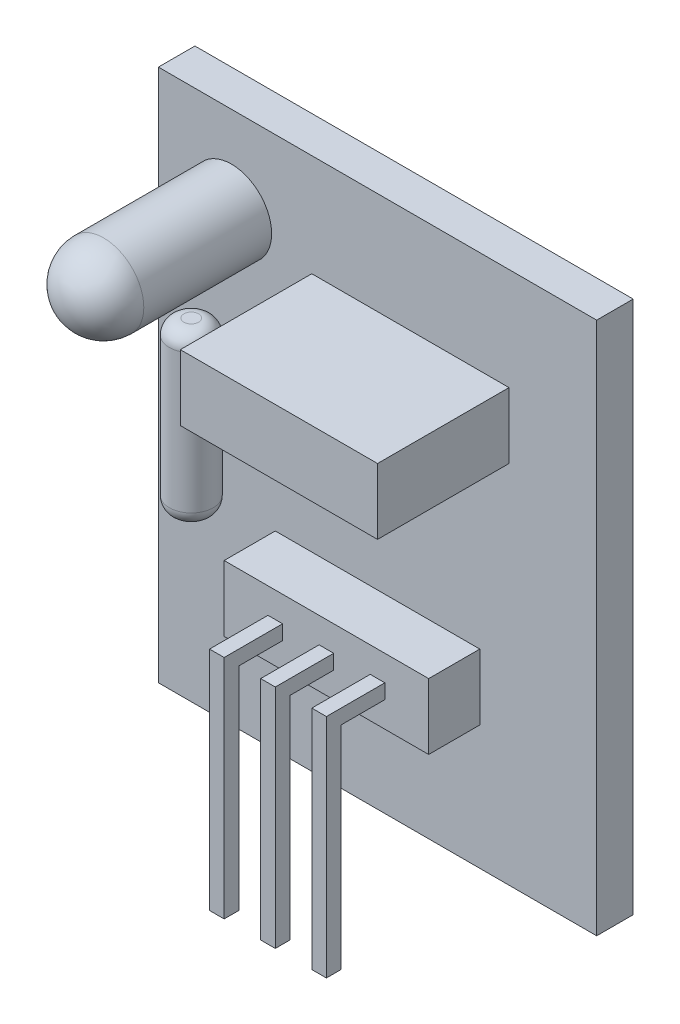
ISO-10303-21;
HEADER;
FILE_DESCRIPTION(('STEP AP214'),'2;1');
FILE_NAME('part.step','',(''),(''),'','','');
FILE_SCHEMA(('AUTOMOTIVE_DESIGN { 1 0 10303 214 1 1 1 1 }'));
ENDSEC;
DATA;
#1=APPLICATION_CONTEXT('core data for automotive mechanical design processes');
#2=APPLICATION_PROTOCOL_DEFINITION('international standard','automotive_design',2000,#1);
#3=PRODUCT_CONTEXT('',#1,'mechanical');
#4=PRODUCT('Part','Part','',(#3));
#5=PRODUCT_RELATED_PRODUCT_CATEGORY('part','',(#4));
#6=PRODUCT_DEFINITION_FORMATION('','',#4);
#7=PRODUCT_DEFINITION_CONTEXT('part definition',#1,'design');
#8=PRODUCT_DEFINITION('design','',#6,#7);
#9=PRODUCT_DEFINITION_SHAPE('','',#8);
#10=(LENGTH_UNIT() NAMED_UNIT(*) SI_UNIT(.MILLI.,.METRE.));
#11=(NAMED_UNIT(*) PLANE_ANGLE_UNIT() SI_UNIT($,.RADIAN.));
#12=(NAMED_UNIT(*) SI_UNIT($,.STERADIAN.) SOLID_ANGLE_UNIT());
#13=UNCERTAINTY_MEASURE_WITH_UNIT(LENGTH_MEASURE(1.E-05),#10,'distance_accuracy_value','');
#14=(GEOMETRIC_REPRESENTATION_CONTEXT(3) GLOBAL_UNCERTAINTY_ASSIGNED_CONTEXT((#13)) GLOBAL_UNIT_ASSIGNED_CONTEXT((#10,
#11,#12)) REPRESENTATION_CONTEXT('',''));
#15=CARTESIAN_POINT('',(0.,0.,0.));
#16=DIRECTION('',(0.,0.,1.));
#17=DIRECTION('',(1.,0.,0.));
#18=AXIS2_PLACEMENT_3D('',#15,#16,#17);
#19=CARTESIAN_POINT('',(-5.842,2.921,1.27));
#20=DIRECTION('',(0.,-1.,0.));
#21=DIRECTION('',(0.,0.,-1.));
#22=AXIS2_PLACEMENT_3D('',#19,#20,#21);
#23=CYLINDRICAL_SURFACE('',#22,0.762);
#24=CARTESIAN_POINT('',(-5.842,-2.413,1.27));
#25=DIRECTION('',(0.,1.,0.));
#26=DIRECTION('',(0.,0.,1.));
#27=AXIS2_PLACEMENT_3D('',#24,#25,#26);
#28=CIRCLE('',#27,0.762);
#29=CARTESIAN_POINT('',(-5.842,-2.413,2.032));
#30=VERTEX_POINT('',#29);
#31=EDGE_CURVE('E70',#30,#30,#28,.T.);
#32=ORIENTED_EDGE('',*,*,#31,.T.);
#33=EDGE_LOOP('',(#32));
#34=FACE_BOUND('',#33,.T.);
#35=CARTESIAN_POINT('',(-5.842,2.413,1.27));
#36=DIRECTION('',(0.,1.,0.));
#37=DIRECTION('',(0.,0.,1.));
#38=AXIS2_PLACEMENT_3D('',#35,#36,#37);
#39=CIRCLE('',#38,0.762);
#40=CARTESIAN_POINT('',(-5.842,2.413,2.032));
#41=VERTEX_POINT('',#40);
#42=EDGE_CURVE('E74',#41,#41,#39,.F.);
#43=ORIENTED_EDGE('',*,*,#42,.T.);
#44=EDGE_LOOP('',(#43));
#45=FACE_BOUND('',#44,.T.);
#46=ADVANCED_FACE('F59',(#34,#45),#23,.T.);
#47=CARTESIAN_POINT('',(-5.842,2.921,1.27));
#48=DIRECTION('',(0.,1.,0.));
#49=DIRECTION('',(0.,0.,1.));
#50=AXIS2_PLACEMENT_3D('',#47,#48,#49);
#51=PLANE('',#50);
#52=CARTESIAN_POINT('',(-5.842,2.921,1.27));
#53=DIRECTION('',(0.,1.,0.));
#54=DIRECTION('',(0.,0.,1.));
#55=AXIS2_PLACEMENT_3D('',#52,#53,#54);
#56=CIRCLE('',#55,0.254);
#57=CARTESIAN_POINT('',(-5.842,2.921,1.524));
#58=VERTEX_POINT('',#57);
#59=EDGE_CURVE('E11',#58,#58,#56,.T.);
#60=ORIENTED_EDGE('',*,*,#59,.T.);
#61=EDGE_LOOP('',(#60));
#62=FACE_BOUND('',#61,.T.);
#63=ADVANCED_FACE('F90',(#62),#51,.T.);
#64=CARTESIAN_POINT('',(-5.842,-2.921,1.27));
#65=DIRECTION('',(0.,1.,0.));
#66=DIRECTION('',(0.,0.,1.));
#67=AXIS2_PLACEMENT_3D('',#64,#65,#66);
#68=PLANE('',#67);
#69=CARTESIAN_POINT('',(-5.842,-2.921,1.27));
#70=DIRECTION('',(0.,1.,0.));
#71=DIRECTION('',(0.,0.,1.));
#72=AXIS2_PLACEMENT_3D('',#69,#70,#71);
#73=CIRCLE('',#72,0.254);
#74=CARTESIAN_POINT('',(-5.842,-2.921,1.524));
#75=VERTEX_POINT('',#74);
#76=EDGE_CURVE('E66',#75,#75,#73,.F.);
#77=ORIENTED_EDGE('',*,*,#76,.T.);
#78=EDGE_LOOP('',(#77));
#79=FACE_BOUND('',#78,.T.);
#80=ADVANCED_FACE('F87',(#79),#68,.F.);
#81=CARTESIAN_POINT('',(-5.842,-2.413,1.27));
#82=DIRECTION('',(0.,1.,0.));
#83=DIRECTION('',(0.,0.,1.));
#84=AXIS2_PLACEMENT_3D('',#81,#82,#83);
#85=DEGENERATE_TOROIDAL_SURFACE('',#84,0.254,0.508,.T.);
#86=ORIENTED_EDGE('',*,*,#76,.F.);
#87=EDGE_LOOP('',(#86));
#88=FACE_BOUND('',#87,.T.);
#89=ORIENTED_EDGE('',*,*,#31,.F.);
#90=EDGE_LOOP('',(#89));
#91=FACE_BOUND('',#90,.T.);
#92=ADVANCED_FACE('F83',(#88,#91),#85,.T.);
#93=CARTESIAN_POINT('',(-5.842,2.413,1.27));
#94=DIRECTION('',(0.,1.,0.));
#95=DIRECTION('',(0.,0.,1.));
#96=AXIS2_PLACEMENT_3D('',#93,#94,#95);
#97=DEGENERATE_TOROIDAL_SURFACE('',#96,0.254,0.508,.T.);
#98=ORIENTED_EDGE('',*,*,#42,.F.);
#99=EDGE_LOOP('',(#98));
#100=FACE_BOUND('',#99,.T.);
#101=ORIENTED_EDGE('',*,*,#59,.F.);
#102=EDGE_LOOP('',(#101));
#103=FACE_BOUND('',#102,.T.);
#104=ADVANCED_FACE('F61',(#100,#103),#97,.T.);
#105=CLOSED_SHELL('',(#46,#63,#80,#92,#104));
#106=MANIFOLD_SOLID_BREP('B2',#105);
#107=CARTESIAN_POINT('',(0.,0.,0.635));
#108=DIRECTION('',(0.,0.,1.));
#109=DIRECTION('',(1.,0.,0.));
#110=AXIS2_PLACEMENT_3D('',#107,#108,#109);
#111=PLANE('',#110);
#112=CARTESIAN_POINT('',(-5.08,6.223,0.635));
#113=DIRECTION('',(0.,0.,1.));
#114=DIRECTION('',(1.,0.,0.));
#115=AXIS2_PLACEMENT_3D('',#112,#113,#114);
#116=CIRCLE('',#115,1.397);
#117=CARTESIAN_POINT('',(-3.683,6.223,0.635));
#118=VERTEX_POINT('',#117);
#119=EDGE_CURVE('E698',#118,#118,#116,.T.);
#120=ORIENTED_EDGE('',*,*,#119,.F.);
#121=EDGE_LOOP('',(#120));
#122=FACE_BOUND('',#121,.T.);
#123=DIRECTION('',(0.,1.,0.));
#124=VECTOR('',#123,1.);
#125=CARTESIAN_POINT('',(7.62,9.271,0.635));
#126=LINE('',#125,#124);
#127=CARTESIAN_POINT('',(7.62,-9.271,0.635));
#128=VERTEX_POINT('',#127);
#129=CARTESIAN_POINT('',(7.62,9.271,0.635));
#130=VERTEX_POINT('',#129);
#131=EDGE_CURVE('E621',#128,#130,#126,.T.);
#132=ORIENTED_EDGE('',*,*,#131,.T.);
#133=DIRECTION('',(-1.,0.,0.));
#134=VECTOR('',#133,1.);
#135=CARTESIAN_POINT('',(-7.62,9.271,0.635));
#136=LINE('',#135,#134);
#137=CARTESIAN_POINT('',(-7.62,9.271,0.635));
#138=VERTEX_POINT('',#137);
#139=EDGE_CURVE('E625',#130,#138,#136,.T.);
#140=ORIENTED_EDGE('',*,*,#139,.T.);
#141=DIRECTION('',(0.,-1.,0.));
#142=VECTOR('',#141,1.);
#143=CARTESIAN_POINT('',(-7.62,9.271,0.635));
#144=LINE('',#143,#142);
#145=CARTESIAN_POINT('',(-7.62,-9.271,0.635));
#146=VERTEX_POINT('',#145);
#147=EDGE_CURVE('E629',#138,#146,#144,.T.);
#148=ORIENTED_EDGE('',*,*,#147,.T.);
#149=DIRECTION('',(1.,0.,0.));
#150=VECTOR('',#149,1.);
#151=CARTESIAN_POINT('',(-7.62,-9.271,0.635));
#152=LINE('',#151,#150);
#153=EDGE_CURVE('E632',#146,#128,#152,.T.);
#154=ORIENTED_EDGE('',*,*,#153,.T.);
#155=EDGE_LOOP('',(#132,#140,#148,#154));
#156=FACE_BOUND('',#155,.T.);
#157=DIRECTION('',(-1.,0.,0.));
#158=VECTOR('',#157,1.);
#159=CARTESIAN_POINT('',(-3.556,-2.667,0.635));
#160=LINE('',#159,#158);
#161=CARTESIAN_POINT('',(3.556,-2.667,0.635));
#162=VERTEX_POINT('',#161);
#163=CARTESIAN_POINT('',(-3.556,-2.667,0.635));
#164=VERTEX_POINT('',#163);
#165=EDGE_CURVE('E598',#162,#164,#160,.T.);
#166=ORIENTED_EDGE('',*,*,#165,.F.);
#167=DIRECTION('',(0.,1.,0.));
#168=VECTOR('',#167,1.);
#169=CARTESIAN_POINT('',(3.556,-2.667,0.635));
#170=LINE('',#169,#168);
#171=CARTESIAN_POINT('',(3.556,-4.953,0.635));
#172=VERTEX_POINT('',#171);
#173=EDGE_CURVE('E505',#172,#162,#170,.T.);
#174=ORIENTED_EDGE('',*,*,#173,.F.);
#175=DIRECTION('',(1.,0.,0.));
#176=VECTOR('',#175,1.);
#177=CARTESIAN_POINT('',(-3.556,-4.953,0.635));
#178=LINE('',#177,#176);
#179=CARTESIAN_POINT('',(-3.556,-4.953,0.635));
#180=VERTEX_POINT('',#179);
#181=EDGE_CURVE('E585',#180,#172,#178,.T.);
#182=ORIENTED_EDGE('',*,*,#181,.F.);
#183=DIRECTION('',(0.,-1.,0.));
#184=VECTOR('',#183,1.);
#185=CARTESIAN_POINT('',(-3.556,-2.667,0.635));
#186=LINE('',#185,#184);
#187=EDGE_CURVE('E601',#164,#180,#186,.T.);
#188=ORIENTED_EDGE('',*,*,#187,.F.);
#189=EDGE_LOOP('',(#166,#174,#182,#188));
#190=FACE_BOUND('',#189,.T.);
#191=DIRECTION('',(-1.,0.,0.));
#192=VECTOR('',#191,1.);
#193=CARTESIAN_POINT('',(-2.286,5.715,0.635));
#194=LINE('',#193,#192);
#195=CARTESIAN_POINT('',(4.572,5.715,0.635));
#196=VERTEX_POINT('',#195);
#197=CARTESIAN_POINT('',(-2.286,5.715,0.635));
#198=VERTEX_POINT('',#197);
#199=EDGE_CURVE('E690',#196,#198,#194,.T.);
#200=ORIENTED_EDGE('',*,*,#199,.F.);
#201=DIRECTION('',(0.,1.,0.));
#202=VECTOR('',#201,1.);
#203=CARTESIAN_POINT('',(4.572,5.715,0.635));
#204=LINE('',#203,#202);
#205=CARTESIAN_POINT('',(4.572,3.429,0.635));
#206=VERTEX_POINT('',#205);
#207=EDGE_CURVE('E385',#206,#196,#204,.T.);
#208=ORIENTED_EDGE('',*,*,#207,.F.);
#209=DIRECTION('',(1.,0.,0.));
#210=VECTOR('',#209,1.);
#211=CARTESIAN_POINT('',(-2.286,3.429,0.635));
#212=LINE('',#211,#210);
#213=CARTESIAN_POINT('',(-2.286,3.429,0.635));
#214=VERTEX_POINT('',#213);
#215=EDGE_CURVE('E381',#214,#206,#212,.T.);
#216=ORIENTED_EDGE('',*,*,#215,.F.);
#217=DIRECTION('',(0.,-1.,0.));
#218=VECTOR('',#217,1.);
#219=CARTESIAN_POINT('',(-2.286,5.715,0.635));
#220=LINE('',#219,#218);
#221=EDGE_CURVE('E692',#198,#214,#220,.T.);
#222=ORIENTED_EDGE('',*,*,#221,.F.);
#223=EDGE_LOOP('',(#200,#208,#216,#222));
#224=FACE_BOUND('',#223,.T.);
#225=ADVANCED_FACE('F160',(#122,#156,#190,#224),#111,.T.);
#226=CARTESIAN_POINT('',(1.524,-4.064,4.445));
#227=DIRECTION('',(0.,1.,0.));
#228=DIRECTION('',(0.,0.,1.));
#229=AXIS2_PLACEMENT_3D('',#226,#227,#228);
#230=PLANE('',#229);
#231=DIRECTION('',(1.,0.,0.));
#232=VECTOR('',#231,1.);
#233=CARTESIAN_POINT('',(1.524,-4.064,3.937));
#234=LINE('',#233,#232);
#235=CARTESIAN_POINT('',(1.524,-4.064,3.937));
#236=VERTEX_POINT('',#235);
#237=CARTESIAN_POINT('',(2.032,-4.064,3.937));
#238=VERTEX_POINT('',#237);
#239=EDGE_CURVE('E428',#236,#238,#234,.T.);
#240=ORIENTED_EDGE('',*,*,#239,.F.);
#241=DIRECTION('',(0.,0.,-1.));
#242=VECTOR('',#241,1.);
#243=CARTESIAN_POINT('',(1.524,-4.064,4.445));
#244=LINE('',#243,#242);
#245=CARTESIAN_POINT('',(1.524,-4.064,2.413));
#246=VERTEX_POINT('',#245);
#247=EDGE_CURVE('E550',#236,#246,#244,.T.);
#248=ORIENTED_EDGE('',*,*,#247,.T.);
#249=DIRECTION('',(1.,0.,0.));
#250=VECTOR('',#249,1.);
#251=CARTESIAN_POINT('',(1.524,-4.064,2.413));
#252=LINE('',#251,#250);
#253=CARTESIAN_POINT('',(2.032,-4.064,2.413));
#254=VERTEX_POINT('',#253);
#255=EDGE_CURVE('E557',#246,#254,#252,.T.);
#256=ORIENTED_EDGE('',*,*,#255,.T.);
#257=DIRECTION('',(0.,0.,-1.));
#258=VECTOR('',#257,1.);
#259=CARTESIAN_POINT('',(2.032,-4.064,4.445));
#260=LINE('',#259,#258);
#261=EDGE_CURVE('E553',#238,#254,#260,.T.);
#262=ORIENTED_EDGE('',*,*,#261,.F.);
#263=EDGE_LOOP('',(#240,#248,#256,#262));
#264=FACE_BOUND('',#263,.T.);
#265=ADVANCED_FACE('F682',(#264),#230,.F.);
#266=CARTESIAN_POINT('',(-0.253999999999999,-4.064,4.445));
#267=DIRECTION('',(0.,1.,0.));
#268=DIRECTION('',(0.,0.,1.));
#269=AXIS2_PLACEMENT_3D('',#266,#267,#268);
#270=PLANE('',#269);
#271=DIRECTION('',(1.,0.,0.));
#272=VECTOR('',#271,1.);
#273=CARTESIAN_POINT('',(-0.253999999999999,-4.064,3.937));
#274=LINE('',#273,#272);
#275=CARTESIAN_POINT('',(-0.253999999999999,-4.064,3.937));
#276=VERTEX_POINT('',#275);
#277=CARTESIAN_POINT('',(0.254000000000001,-4.064,3.937));
#278=VERTEX_POINT('',#277);
#279=EDGE_CURVE('E416',#276,#278,#274,.T.);
#280=ORIENTED_EDGE('',*,*,#279,.F.);
#281=DIRECTION('',(0.,0.,-1.));
#282=VECTOR('',#281,1.);
#283=CARTESIAN_POINT('',(-0.253999999999999,-4.064,4.445));
#284=LINE('',#283,#282);
#285=CARTESIAN_POINT('',(-0.253999999999999,-4.064,2.413));
#286=VERTEX_POINT('',#285);
#287=EDGE_CURVE('E514',#276,#286,#284,.T.);
#288=ORIENTED_EDGE('',*,*,#287,.T.);
#289=DIRECTION('',(1.,0.,0.));
#290=VECTOR('',#289,1.);
#291=CARTESIAN_POINT('',(-0.253999999999999,-4.064,2.413));
#292=LINE('',#291,#290);
#293=CARTESIAN_POINT('',(0.254000000000001,-4.064,2.413));
#294=VERTEX_POINT('',#293);
#295=EDGE_CURVE('E521',#286,#294,#292,.T.);
#296=ORIENTED_EDGE('',*,*,#295,.T.);
#297=DIRECTION('',(0.,0.,-1.));
#298=VECTOR('',#297,1.);
#299=CARTESIAN_POINT('',(0.254000000000001,-4.064,4.445));
#300=LINE('',#299,#298);
#301=EDGE_CURVE('E517',#278,#294,#300,.T.);
#302=ORIENTED_EDGE('',*,*,#301,.F.);
#303=EDGE_LOOP('',(#280,#288,#296,#302));
#304=FACE_BOUND('',#303,.T.);
#305=ADVANCED_FACE('F770',(#304),#270,.F.);
#306=CARTESIAN_POINT('',(-2.032,-4.064,4.445));
#307=DIRECTION('',(0.,1.,0.));
#308=DIRECTION('',(0.,0.,1.));
#309=AXIS2_PLACEMENT_3D('',#306,#307,#308);
#310=PLANE('',#309);
#311=DIRECTION('',(1.,0.,0.));
#312=VECTOR('',#311,1.);
#313=CARTESIAN_POINT('',(-2.032,-4.064,3.937));
#314=LINE('',#313,#312);
#315=CARTESIAN_POINT('',(-2.032,-4.064,3.937));
#316=VERTEX_POINT('',#315);
#317=CARTESIAN_POINT('',(-1.524,-4.064,3.937));
#318=VERTEX_POINT('',#317);
#319=EDGE_CURVE('E402',#316,#318,#314,.T.);
#320=ORIENTED_EDGE('',*,*,#319,.F.);
#321=DIRECTION('',(0.,0.,-1.));
#322=VECTOR('',#321,1.);
#323=CARTESIAN_POINT('',(-2.032,-4.064,4.445));
#324=LINE('',#323,#322);
#325=CARTESIAN_POINT('',(-2.032,-4.064,2.413));
#326=VERTEX_POINT('',#325);
#327=EDGE_CURVE('E184',#316,#326,#324,.T.);
#328=ORIENTED_EDGE('',*,*,#327,.T.);
#329=DIRECTION('',(1.,0.,0.));
#330=VECTOR('',#329,1.);
#331=CARTESIAN_POINT('',(-2.032,-4.064,2.413));
#332=LINE('',#331,#330);
#333=CARTESIAN_POINT('',(-1.524,-4.064,2.413));
#334=VERTEX_POINT('',#333);
#335=EDGE_CURVE('E474',#326,#334,#332,.T.);
#336=ORIENTED_EDGE('',*,*,#335,.T.);
#337=DIRECTION('',(0.,0.,-1.));
#338=VECTOR('',#337,1.);
#339=CARTESIAN_POINT('',(-1.524,-4.064,4.445));
#340=LINE('',#339,#338);
#341=EDGE_CURVE('E480',#318,#334,#340,.T.);
#342=ORIENTED_EDGE('',*,*,#341,.F.);
#343=EDGE_LOOP('',(#320,#328,#336,#342));
#344=FACE_BOUND('',#343,.T.);
#345=ADVANCED_FACE('F766',(#344),#310,.F.);
#346=CARTESIAN_POINT('',(0.,0.,2.413));
#347=DIRECTION('',(0.,0.,1.));
#348=DIRECTION('',(1.,0.,0.));
#349=AXIS2_PLACEMENT_3D('',#346,#347,#348);
#350=PLANE('',#349);
#351=DIRECTION('',(0.,1.,0.));
#352=VECTOR('',#351,1.);
#353=CARTESIAN_POINT('',(3.556,-2.667,2.413));
#354=LINE('',#353,#352);
#355=CARTESIAN_POINT('',(3.556,-4.953,2.413));
#356=VERTEX_POINT('',#355);
#357=CARTESIAN_POINT('',(3.556,-2.667,2.413));
#358=VERTEX_POINT('',#357);
#359=EDGE_CURVE('E580',#356,#358,#354,.T.);
#360=ORIENTED_EDGE('',*,*,#359,.T.);
#361=DIRECTION('',(-1.,0.,0.));
#362=VECTOR('',#361,1.);
#363=CARTESIAN_POINT('',(-3.556,-2.667,2.413));
#364=LINE('',#363,#362);
#365=CARTESIAN_POINT('',(-3.556,-2.667,2.413));
#366=VERTEX_POINT('',#365);
#367=EDGE_CURVE('E584',#358,#366,#364,.T.);
#368=ORIENTED_EDGE('',*,*,#367,.T.);
#369=DIRECTION('',(0.,-1.,0.));
#370=VECTOR('',#369,1.);
#371=CARTESIAN_POINT('',(-3.556,-2.667,2.413));
#372=LINE('',#371,#370);
#373=CARTESIAN_POINT('',(-3.556,-4.953,2.413));
#374=VERTEX_POINT('',#373);
#375=EDGE_CURVE('E588',#366,#374,#372,.T.);
#376=ORIENTED_EDGE('',*,*,#375,.T.);
#377=DIRECTION('',(1.,0.,0.));
#378=VECTOR('',#377,1.);
#379=CARTESIAN_POINT('',(-3.556,-4.953,2.413));
#380=LINE('',#379,#378);
#381=EDGE_CURVE('E591',#374,#356,#380,.T.);
#382=ORIENTED_EDGE('',*,*,#381,.T.);
#383=EDGE_LOOP('',(#360,#368,#376,#382));
#384=FACE_BOUND('',#383,.T.);
#385=DIRECTION('',(-1.,0.,0.));
#386=VECTOR('',#385,1.);
#387=CARTESIAN_POINT('',(1.524,-3.556,2.413));
#388=LINE('',#387,#386);
#389=CARTESIAN_POINT('',(2.032,-3.556,2.413));
#390=VERTEX_POINT('',#389);
#391=CARTESIAN_POINT('',(1.524,-3.556,2.413));
#392=VERTEX_POINT('',#391);
#393=EDGE_CURVE('E566',#390,#392,#388,.T.);
#394=ORIENTED_EDGE('',*,*,#393,.F.);
#395=DIRECTION('',(0.,1.,0.));
#396=VECTOR('',#395,1.);
#397=CARTESIAN_POINT('',(2.032,-3.556,2.413));
#398=LINE('',#397,#396);
#399=EDGE_CURVE('E510',#254,#390,#398,.T.);
#400=ORIENTED_EDGE('',*,*,#399,.F.);
#401=ORIENTED_EDGE('',*,*,#255,.F.);
#402=DIRECTION('',(0.,-1.,0.));
#403=VECTOR('',#402,1.);
#404=CARTESIAN_POINT('',(1.524,-3.556,2.413));
#405=LINE('',#404,#403);
#406=EDGE_CURVE('E561',#392,#246,#405,.T.);
#407=ORIENTED_EDGE('',*,*,#406,.F.);
#408=EDGE_LOOP('',(#394,#400,#401,#407));
#409=FACE_BOUND('',#408,.T.);
#410=DIRECTION('',(-1.,0.,0.));
#411=VECTOR('',#410,1.);
#412=CARTESIAN_POINT('',(-0.253999999999999,-3.556,2.413));
#413=LINE('',#412,#411);
#414=CARTESIAN_POINT('',(0.254,-3.556,2.413));
#415=VERTEX_POINT('',#414);
#416=CARTESIAN_POINT('',(-0.253999999999999,-3.556,2.413));
#417=VERTEX_POINT('',#416);
#418=EDGE_CURVE('E530',#415,#417,#413,.T.);
#419=ORIENTED_EDGE('',*,*,#418,.F.);
#420=DIRECTION('',(0.,1.,0.));
#421=VECTOR('',#420,1.);
#422=CARTESIAN_POINT('',(0.254,-3.556,2.413));
#423=LINE('',#422,#421);
#424=EDGE_CURVE('E486',#294,#415,#423,.T.);
#425=ORIENTED_EDGE('',*,*,#424,.F.);
#426=ORIENTED_EDGE('',*,*,#295,.F.);
#427=DIRECTION('',(0.,-1.,0.));
#428=VECTOR('',#427,1.);
#429=CARTESIAN_POINT('',(-0.253999999999999,-3.556,2.413));
#430=LINE('',#429,#428);
#431=EDGE_CURVE('E525',#417,#286,#430,.T.);
#432=ORIENTED_EDGE('',*,*,#431,.F.);
#433=EDGE_LOOP('',(#419,#425,#426,#432));
#434=FACE_BOUND('',#433,.T.);
#435=DIRECTION('',(-1.,0.,0.));
#436=VECTOR('',#435,1.);
#437=CARTESIAN_POINT('',(-2.032,-3.556,2.413));
#438=LINE('',#437,#436);
#439=CARTESIAN_POINT('',(-1.524,-3.556,2.413));
#440=VERTEX_POINT('',#439);
#441=CARTESIAN_POINT('',(-2.032,-3.556,2.413));
#442=VERTEX_POINT('',#441);
#443=EDGE_CURVE('E485',#440,#442,#438,.T.);
#444=ORIENTED_EDGE('',*,*,#443,.F.);
#445=DIRECTION('',(0.,1.,0.));
#446=VECTOR('',#445,1.);
#447=CARTESIAN_POINT('',(-1.524,-3.556,2.413));
#448=LINE('',#447,#446);
#449=EDGE_CURVE('E481',#334,#440,#448,.T.);
#450=ORIENTED_EDGE('',*,*,#449,.F.);
#451=ORIENTED_EDGE('',*,*,#335,.F.);
#452=DIRECTION('',(0.,-1.,0.));
#453=VECTOR('',#452,1.);
#454=CARTESIAN_POINT('',(-2.032,-3.556,2.413));
#455=LINE('',#454,#453);
#456=EDGE_CURVE('E489',#442,#326,#455,.T.);
#457=ORIENTED_EDGE('',*,*,#456,.F.);
#458=EDGE_LOOP('',(#444,#450,#451,#457));
#459=FACE_BOUND('',#458,.T.);
#460=ADVANCED_FACE('F769',(#384,#409,#434,#459),#350,.T.);
#461=CARTESIAN_POINT('',(7.62,9.271,0.635));
#462=DIRECTION('',(-1.,0.,0.));
#463=DIRECTION('',(0.,-1.,0.));
#464=AXIS2_PLACEMENT_3D('',#461,#462,#463);
#465=PLANE('',#464);
#466=DIRECTION('',(0.,1.,0.));
#467=VECTOR('',#466,1.);
#468=CARTESIAN_POINT('',(7.62,9.271,-0.635));
#469=LINE('',#468,#467);
#470=CARTESIAN_POINT('',(7.62,-9.271,-0.635));
#471=VERTEX_POINT('',#470);
#472=CARTESIAN_POINT('',(7.62,9.271,-0.635));
#473=VERTEX_POINT('',#472);
#474=EDGE_CURVE('E620',#471,#473,#469,.T.);
#475=ORIENTED_EDGE('',*,*,#474,.T.);
#476=DIRECTION('',(0.,0.,-1.));
#477=VECTOR('',#476,1.);
#478=CARTESIAN_POINT('',(7.62,9.271,0.635));
#479=LINE('',#478,#477);
#480=EDGE_CURVE('E169',#130,#473,#479,.T.);
#481=ORIENTED_EDGE('',*,*,#480,.F.);
#482=ORIENTED_EDGE('',*,*,#131,.F.);
#483=DIRECTION('',(0.,0.,-1.));
#484=VECTOR('',#483,1.);
#485=CARTESIAN_POINT('',(7.62,-9.271,0.635));
#486=LINE('',#485,#484);
#487=EDGE_CURVE('E635',#128,#471,#486,.T.);
#488=ORIENTED_EDGE('',*,*,#487,.T.);
#489=EDGE_LOOP('',(#475,#481,#482,#488));
#490=FACE_BOUND('',#489,.T.);
#491=ADVANCED_FACE('F666',(#490),#465,.F.);
#492=CARTESIAN_POINT('',(-7.62,9.271,0.635));
#493=DIRECTION('',(0.,-1.,0.));
#494=DIRECTION('',(0.,0.,-1.));
#495=AXIS2_PLACEMENT_3D('',#492,#493,#494);
#496=PLANE('',#495);
#497=DIRECTION('',(-1.,0.,0.));
#498=VECTOR('',#497,1.);
#499=CARTESIAN_POINT('',(-7.62,9.271,-0.635));
#500=LINE('',#499,#498);
#501=CARTESIAN_POINT('',(-7.62,9.271,-0.635));
#502=VERTEX_POINT('',#501);
#503=EDGE_CURVE('E639',#473,#502,#500,.T.);
#504=ORIENTED_EDGE('',*,*,#503,.T.);
#505=DIRECTION('',(0.,0.,-1.));
#506=VECTOR('',#505,1.);
#507=CARTESIAN_POINT('',(-7.62,9.271,0.635));
#508=LINE('',#507,#506);
#509=EDGE_CURVE('E654',#138,#502,#508,.T.);
#510=ORIENTED_EDGE('',*,*,#509,.F.);
#511=ORIENTED_EDGE('',*,*,#139,.F.);
#512=ORIENTED_EDGE('',*,*,#480,.T.);
#513=EDGE_LOOP('',(#504,#510,#511,#512));
#514=FACE_BOUND('',#513,.T.);
#515=ADVANCED_FACE('F661',(#514),#496,.F.);
#516=CARTESIAN_POINT('',(-7.62,9.271,0.635));
#517=DIRECTION('',(1.,0.,0.));
#518=DIRECTION('',(0.,1.,0.));
#519=AXIS2_PLACEMENT_3D('',#516,#517,#518);
#520=PLANE('',#519);
#521=DIRECTION('',(0.,-1.,0.));
#522=VECTOR('',#521,1.);
#523=CARTESIAN_POINT('',(-7.62,9.271,-0.635));
#524=LINE('',#523,#522);
#525=CARTESIAN_POINT('',(-7.62,-9.271,-0.635));
#526=VERTEX_POINT('',#525);
#527=EDGE_CURVE('E642',#502,#526,#524,.T.);
#528=ORIENTED_EDGE('',*,*,#527,.T.);
#529=DIRECTION('',(0.,0.,-1.));
#530=VECTOR('',#529,1.);
#531=CARTESIAN_POINT('',(-7.62,-9.271,0.635));
#532=LINE('',#531,#530);
#533=EDGE_CURVE('E650',#146,#526,#532,.T.);
#534=ORIENTED_EDGE('',*,*,#533,.F.);
#535=ORIENTED_EDGE('',*,*,#147,.F.);
#536=ORIENTED_EDGE('',*,*,#509,.T.);
#537=EDGE_LOOP('',(#528,#534,#535,#536));
#538=FACE_BOUND('',#537,.T.);
#539=ADVANCED_FACE('F674',(#538),#520,.F.);
#540=CARTESIAN_POINT('',(-7.62,-9.271,0.635));
#541=DIRECTION('',(0.,1.,0.));
#542=DIRECTION('',(0.,0.,1.));
#543=AXIS2_PLACEMENT_3D('',#540,#541,#542);
#544=PLANE('',#543);
#545=DIRECTION('',(1.,0.,0.));
#546=VECTOR('',#545,1.);
#547=CARTESIAN_POINT('',(-7.62,-9.271,-0.635));
#548=LINE('',#547,#546);
#549=EDGE_CURVE('E626',#526,#471,#548,.T.);
#550=ORIENTED_EDGE('',*,*,#549,.T.);
#551=ORIENTED_EDGE('',*,*,#487,.F.);
#552=ORIENTED_EDGE('',*,*,#153,.F.);
#553=ORIENTED_EDGE('',*,*,#533,.T.);
#554=EDGE_LOOP('',(#550,#551,#552,#553));
#555=FACE_BOUND('',#554,.T.);
#556=ADVANCED_FACE('F678',(#555),#544,.F.);
#557=CARTESIAN_POINT('',(0.,0.,-0.635));
#558=DIRECTION('',(0.,0.,1.));
#559=DIRECTION('',(1.,0.,0.));
#560=AXIS2_PLACEMENT_3D('',#557,#558,#559);
#561=PLANE('',#560);
#562=ORIENTED_EDGE('',*,*,#474,.F.);
#563=ORIENTED_EDGE('',*,*,#549,.F.);
#564=ORIENTED_EDGE('',*,*,#527,.F.);
#565=ORIENTED_EDGE('',*,*,#503,.F.);
#566=EDGE_LOOP('',(#562,#563,#564,#565));
#567=FACE_BOUND('',#566,.T.);
#568=ADVANCED_FACE('F670',(#567),#561,.F.);
#569=CARTESIAN_POINT('',(3.556,-2.667,2.413));
#570=DIRECTION('',(-1.,0.,0.));
#571=DIRECTION('',(0.,0.,1.));
#572=AXIS2_PLACEMENT_3D('',#569,#570,#571);
#573=PLANE('',#572);
#574=ORIENTED_EDGE('',*,*,#173,.T.);
#575=DIRECTION('',(0.,0.,-1.));
#576=VECTOR('',#575,1.);
#577=CARTESIAN_POINT('',(3.556,-2.667,2.413));
#578=LINE('',#577,#576);
#579=EDGE_CURVE('E617',#358,#162,#578,.T.);
#580=ORIENTED_EDGE('',*,*,#579,.F.);
#581=ORIENTED_EDGE('',*,*,#359,.F.);
#582=DIRECTION('',(0.,0.,-1.));
#583=VECTOR('',#582,1.);
#584=CARTESIAN_POINT('',(3.556,-4.953,2.413));
#585=LINE('',#584,#583);
#586=EDGE_CURVE('E594',#356,#172,#585,.T.);
#587=ORIENTED_EDGE('',*,*,#586,.T.);
#588=EDGE_LOOP('',(#574,#580,#581,#587));
#589=FACE_BOUND('',#588,.T.);
#590=ADVANCED_FACE('F834',(#589),#573,.F.);
#591=CARTESIAN_POINT('',(-3.556,-2.667,2.413));
#592=DIRECTION('',(0.,-1.,0.));
#593=DIRECTION('',(0.,0.,-1.));
#594=AXIS2_PLACEMENT_3D('',#591,#592,#593);
#595=PLANE('',#594);
#596=ORIENTED_EDGE('',*,*,#165,.T.);
#597=DIRECTION('',(0.,0.,-1.));
#598=VECTOR('',#597,1.);
#599=CARTESIAN_POINT('',(-3.556,-2.667,2.413));
#600=LINE('',#599,#598);
#601=EDGE_CURVE('E613',#366,#164,#600,.T.);
#602=ORIENTED_EDGE('',*,*,#601,.F.);
#603=ORIENTED_EDGE('',*,*,#367,.F.);
#604=ORIENTED_EDGE('',*,*,#579,.T.);
#605=EDGE_LOOP('',(#596,#602,#603,#604));
#606=FACE_BOUND('',#605,.T.);
#607=ADVANCED_FACE('F830',(#606),#595,.F.);
#608=CARTESIAN_POINT('',(-3.556,-2.667,2.413));
#609=DIRECTION('',(1.,0.,0.));
#610=DIRECTION('',(0.,1.,0.));
#611=AXIS2_PLACEMENT_3D('',#608,#609,#610);
#612=PLANE('',#611);
#613=ORIENTED_EDGE('',*,*,#187,.T.);
#614=DIRECTION('',(0.,0.,-1.));
#615=VECTOR('',#614,1.);
#616=CARTESIAN_POINT('',(-3.556,-4.953,2.413));
#617=LINE('',#616,#615);
#618=EDGE_CURVE('E610',#374,#180,#617,.T.);
#619=ORIENTED_EDGE('',*,*,#618,.F.);
#620=ORIENTED_EDGE('',*,*,#375,.F.);
#621=ORIENTED_EDGE('',*,*,#601,.T.);
#622=EDGE_LOOP('',(#613,#619,#620,#621));
#623=FACE_BOUND('',#622,.T.);
#624=ADVANCED_FACE('F826',(#623),#612,.F.);
#625=CARTESIAN_POINT('',(-3.556,-4.953,2.413));
#626=DIRECTION('',(0.,1.,0.));
#627=DIRECTION('',(-1.,0.,0.));
#628=AXIS2_PLACEMENT_3D('',#625,#626,#627);
#629=PLANE('',#628);
#630=ORIENTED_EDGE('',*,*,#181,.T.);
#631=ORIENTED_EDGE('',*,*,#586,.F.);
#632=ORIENTED_EDGE('',*,*,#381,.F.);
#633=ORIENTED_EDGE('',*,*,#618,.T.);
#634=EDGE_LOOP('',(#630,#631,#632,#633));
#635=FACE_BOUND('',#634,.T.);
#636=ADVANCED_FACE('F806',(#635),#629,.F.);
#637=CARTESIAN_POINT('',(2.032,-3.556,4.445));
#638=DIRECTION('',(-1.,0.,0.));
#639=DIRECTION('',(0.,0.,1.));
#640=AXIS2_PLACEMENT_3D('',#637,#638,#639);
#641=PLANE('',#640);
#642=ORIENTED_EDGE('',*,*,#399,.T.);
#643=DIRECTION('',(0.,0.,-1.));
#644=VECTOR('',#643,1.);
#645=CARTESIAN_POINT('',(2.032,-3.556,4.445));
#646=LINE('',#645,#644);
#647=CARTESIAN_POINT('',(2.032,-3.556,4.445));
#648=VERTEX_POINT('',#647);
#649=EDGE_CURVE('E423',#648,#390,#646,.T.);
#650=ORIENTED_EDGE('',*,*,#649,.F.);
#651=DIRECTION('',(0.,1.,0.));
#652=VECTOR('',#651,1.);
#653=CARTESIAN_POINT('',(2.032,-3.556,4.445));
#654=LINE('',#653,#652);
#655=CARTESIAN_POINT('',(2.032,-11.43,4.445));
#656=VERTEX_POINT('',#655);
#657=EDGE_CURVE('E562',#656,#648,#654,.T.);
#658=ORIENTED_EDGE('',*,*,#657,.F.);
#659=DIRECTION('',(0.,0.,1.));
#660=VECTOR('',#659,1.);
#661=CARTESIAN_POINT('',(2.032,-11.43,4.445));
#662=LINE('',#661,#660);
#663=CARTESIAN_POINT('',(2.032,-11.43,3.937));
#664=VERTEX_POINT('',#663);
#665=EDGE_CURVE('E459',#664,#656,#662,.T.);
#666=ORIENTED_EDGE('',*,*,#665,.F.);
#667=DIRECTION('',(0.,1.,0.));
#668=VECTOR('',#667,1.);
#669=CARTESIAN_POINT('',(2.032,-11.43,3.937));
#670=LINE('',#669,#668);
#671=EDGE_CURVE('E392',#664,#238,#670,.T.);
#672=ORIENTED_EDGE('',*,*,#671,.T.);
#673=ORIENTED_EDGE('',*,*,#261,.T.);
#674=EDGE_LOOP('',(#642,#650,#658,#666,#672,#673));
#675=FACE_BOUND('',#674,.T.);
#676=ADVANCED_FACE('F802',(#675),#641,.F.);
#677=CARTESIAN_POINT('',(1.524,-3.556,4.445));
#678=DIRECTION('',(0.,-1.,0.));
#679=DIRECTION('',(1.,0.,0.));
#680=AXIS2_PLACEMENT_3D('',#677,#678,#679);
#681=PLANE('',#680);
#682=ORIENTED_EDGE('',*,*,#393,.T.);
#683=DIRECTION('',(0.,0.,-1.));
#684=VECTOR('',#683,1.);
#685=CARTESIAN_POINT('',(1.524,-3.556,4.445));
#686=LINE('',#685,#684);
#687=CARTESIAN_POINT('',(1.524,-3.556,4.445));
#688=VERTEX_POINT('',#687);
#689=EDGE_CURVE('E546',#688,#392,#686,.T.);
#690=ORIENTED_EDGE('',*,*,#689,.F.);
#691=DIRECTION('',(-1.,0.,0.));
#692=VECTOR('',#691,1.);
#693=CARTESIAN_POINT('',(1.524,-3.556,4.445));
#694=LINE('',#693,#692);
#695=EDGE_CURVE('E574',#648,#688,#694,.T.);
#696=ORIENTED_EDGE('',*,*,#695,.F.);
#697=ORIENTED_EDGE('',*,*,#649,.T.);
#698=EDGE_LOOP('',(#682,#690,#696,#697));
#699=FACE_BOUND('',#698,.T.);
#700=ADVANCED_FACE('F805',(#699),#681,.F.);
#701=CARTESIAN_POINT('',(1.524,-3.556,4.445));
#702=DIRECTION('',(1.,0.,0.));
#703=DIRECTION('',(0.,0.,-1.));
#704=AXIS2_PLACEMENT_3D('',#701,#702,#703);
#705=PLANE('',#704);
#706=ORIENTED_EDGE('',*,*,#406,.T.);
#707=ORIENTED_EDGE('',*,*,#247,.F.);
#708=DIRECTION('',(0.,1.,0.));
#709=VECTOR('',#708,1.);
#710=CARTESIAN_POINT('',(1.524,-11.43,3.937));
#711=LINE('',#710,#709);
#712=CARTESIAN_POINT('',(1.524,-11.43,3.937));
#713=VERTEX_POINT('',#712);
#714=EDGE_CURVE('E388',#713,#236,#711,.T.);
#715=ORIENTED_EDGE('',*,*,#714,.F.);
#716=DIRECTION('',(0.,0.,-1.));
#717=VECTOR('',#716,1.);
#718=CARTESIAN_POINT('',(1.524,-11.43,4.445));
#719=LINE('',#718,#717);
#720=CARTESIAN_POINT('',(1.524,-11.43,4.445));
#721=VERTEX_POINT('',#720);
#722=EDGE_CURVE('E455',#721,#713,#719,.T.);
#723=ORIENTED_EDGE('',*,*,#722,.F.);
#724=DIRECTION('',(0.,-1.,0.));
#725=VECTOR('',#724,1.);
#726=CARTESIAN_POINT('',(1.524,-3.556,4.445));
#727=LINE('',#726,#725);
#728=EDGE_CURVE('E556',#688,#721,#727,.T.);
#729=ORIENTED_EDGE('',*,*,#728,.F.);
#730=ORIENTED_EDGE('',*,*,#689,.T.);
#731=EDGE_LOOP('',(#706,#707,#715,#723,#729,#730));
#732=FACE_BOUND('',#731,.T.);
#733=ADVANCED_FACE('F810',(#732),#705,.F.);
#734=CARTESIAN_POINT('',(0.,0.,4.445));
#735=DIRECTION('',(0.,0.,1.));
#736=DIRECTION('',(1.,0.,0.));
#737=AXIS2_PLACEMENT_3D('',#734,#735,#736);
#738=PLANE('',#737);
#739=ORIENTED_EDGE('',*,*,#657,.T.);
#740=ORIENTED_EDGE('',*,*,#695,.T.);
#741=ORIENTED_EDGE('',*,*,#728,.T.);
#742=DIRECTION('',(-1.,0.,0.));
#743=VECTOR('',#742,1.);
#744=CARTESIAN_POINT('',(1.524,-11.43,4.445));
#745=LINE('',#744,#743);
#746=EDGE_CURVE('E452',#656,#721,#745,.T.);
#747=ORIENTED_EDGE('',*,*,#746,.F.);
#748=EDGE_LOOP('',(#739,#740,#741,#747));
#749=FACE_BOUND('',#748,.T.);
#750=ADVANCED_FACE('F787',(#749),#738,.T.);
#751=CARTESIAN_POINT('',(0.254,-3.556,4.445));
#752=DIRECTION('',(-1.,0.,0.));
#753=DIRECTION('',(0.,-1.,0.));
#754=AXIS2_PLACEMENT_3D('',#751,#752,#753);
#755=PLANE('',#754);
#756=ORIENTED_EDGE('',*,*,#424,.T.);
#757=DIRECTION('',(0.,0.,-1.));
#758=VECTOR('',#757,1.);
#759=CARTESIAN_POINT('',(0.254,-3.556,4.445));
#760=LINE('',#759,#758);
#761=CARTESIAN_POINT('',(0.254,-3.556,4.445));
#762=VERTEX_POINT('',#761);
#763=EDGE_CURVE('E506',#762,#415,#760,.T.);
#764=ORIENTED_EDGE('',*,*,#763,.F.);
#765=DIRECTION('',(0.,1.,0.));
#766=VECTOR('',#765,1.);
#767=CARTESIAN_POINT('',(0.254,-3.556,4.445));
#768=LINE('',#767,#766);
#769=CARTESIAN_POINT('',(0.254000000000001,-11.43,4.445));
#770=VERTEX_POINT('',#769);
#771=EDGE_CURVE('E526',#770,#762,#768,.T.);
#772=ORIENTED_EDGE('',*,*,#771,.F.);
#773=DIRECTION('',(0.,0.,1.));
#774=VECTOR('',#773,1.);
#775=CARTESIAN_POINT('',(0.254000000000001,-11.43,3.937));
#776=LINE('',#775,#774);
#777=CARTESIAN_POINT('',(0.254000000000001,-11.43,3.937));
#778=VERTEX_POINT('',#777);
#779=EDGE_CURVE('E439',#778,#770,#776,.T.);
#780=ORIENTED_EDGE('',*,*,#779,.F.);
#781=DIRECTION('',(0.,1.,0.));
#782=VECTOR('',#781,1.);
#783=CARTESIAN_POINT('',(0.254000000000001,-11.43,3.937));
#784=LINE('',#783,#782);
#785=EDGE_CURVE('E427',#778,#278,#784,.T.);
#786=ORIENTED_EDGE('',*,*,#785,.T.);
#787=ORIENTED_EDGE('',*,*,#301,.T.);
#788=EDGE_LOOP('',(#756,#764,#772,#780,#786,#787));
#789=FACE_BOUND('',#788,.T.);
#790=ADVANCED_FACE('F783',(#789),#755,.F.);
#791=CARTESIAN_POINT('',(-0.253999999999999,-3.556,4.445));
#792=DIRECTION('',(0.,-1.,0.));
#793=DIRECTION('',(1.,0.,0.));
#794=AXIS2_PLACEMENT_3D('',#791,#792,#793);
#795=PLANE('',#794);
#796=ORIENTED_EDGE('',*,*,#418,.T.);
#797=DIRECTION('',(0.,0.,-1.));
#798=VECTOR('',#797,1.);
#799=CARTESIAN_POINT('',(-0.253999999999999,-3.556,4.445));
#800=LINE('',#799,#798);
#801=CARTESIAN_POINT('',(-0.253999999999999,-3.556,4.445));
#802=VERTEX_POINT('',#801);
#803=EDGE_CURVE('E509',#802,#417,#800,.T.);
#804=ORIENTED_EDGE('',*,*,#803,.F.);
#805=DIRECTION('',(-1.,0.,0.));
#806=VECTOR('',#805,1.);
#807=CARTESIAN_POINT('',(-0.253999999999999,-3.556,4.445));
#808=LINE('',#807,#806);
#809=EDGE_CURVE('E538',#762,#802,#808,.T.);
#810=ORIENTED_EDGE('',*,*,#809,.F.);
#811=ORIENTED_EDGE('',*,*,#763,.T.);
#812=EDGE_LOOP('',(#796,#804,#810,#811));
#813=FACE_BOUND('',#812,.T.);
#814=ADVANCED_FACE('F786',(#813),#795,.F.);
#815=CARTESIAN_POINT('',(-0.253999999999999,-3.556,4.445));
#816=DIRECTION('',(1.,0.,0.));
#817=DIRECTION('',(0.,1.,0.));
#818=AXIS2_PLACEMENT_3D('',#815,#816,#817);
#819=PLANE('',#818);
#820=ORIENTED_EDGE('',*,*,#431,.T.);
#821=ORIENTED_EDGE('',*,*,#287,.F.);
#822=DIRECTION('',(0.,1.,0.));
#823=VECTOR('',#822,1.);
#824=CARTESIAN_POINT('',(-0.253999999999999,-11.43,3.937));
#825=LINE('',#824,#823);
#826=CARTESIAN_POINT('',(-0.253999999999999,-11.43,3.937));
#827=VERTEX_POINT('',#826);
#828=EDGE_CURVE('E424',#827,#276,#825,.T.);
#829=ORIENTED_EDGE('',*,*,#828,.F.);
#830=DIRECTION('',(0.,0.,-1.));
#831=VECTOR('',#830,1.);
#832=CARTESIAN_POINT('',(-0.253999999999999,-11.43,3.937));
#833=LINE('',#832,#831);
#834=CARTESIAN_POINT('',(-0.253999999999999,-11.43,4.445));
#835=VERTEX_POINT('',#834);
#836=EDGE_CURVE('E435',#835,#827,#833,.T.);
#837=ORIENTED_EDGE('',*,*,#836,.F.);
#838=DIRECTION('',(0.,-1.,0.));
#839=VECTOR('',#838,1.);
#840=CARTESIAN_POINT('',(-0.253999999999999,-3.556,4.445));
#841=LINE('',#840,#839);
#842=EDGE_CURVE('E520',#802,#835,#841,.T.);
#843=ORIENTED_EDGE('',*,*,#842,.F.);
#844=ORIENTED_EDGE('',*,*,#803,.T.);
#845=EDGE_LOOP('',(#820,#821,#829,#837,#843,#844));
#846=FACE_BOUND('',#845,.T.);
#847=ADVANCED_FACE('F791',(#846),#819,.F.);
#848=CARTESIAN_POINT('',(0.,0.,4.445));
#849=DIRECTION('',(0.,0.,1.));
#850=DIRECTION('',(1.,0.,0.));
#851=AXIS2_PLACEMENT_3D('',#848,#849,#850);
#852=PLANE('',#851);
#853=ORIENTED_EDGE('',*,*,#771,.T.);
#854=ORIENTED_EDGE('',*,*,#809,.T.);
#855=ORIENTED_EDGE('',*,*,#842,.T.);
#856=DIRECTION('',(-1.,0.,0.));
#857=VECTOR('',#856,1.);
#858=CARTESIAN_POINT('',(-0.253999999999999,-11.43,4.445));
#859=LINE('',#858,#857);
#860=EDGE_CURVE('E432',#770,#835,#859,.T.);
#861=ORIENTED_EDGE('',*,*,#860,.F.);
#862=EDGE_LOOP('',(#853,#854,#855,#861));
#863=FACE_BOUND('',#862,.T.);
#864=ADVANCED_FACE('F781',(#863),#852,.T.);
#865=CARTESIAN_POINT('',(-1.524,-3.556,4.445));
#866=DIRECTION('',(-1.,0.,0.));
#867=DIRECTION('',(0.,0.,1.));
#868=AXIS2_PLACEMENT_3D('',#865,#866,#867);
#869=PLANE('',#868);
#870=ORIENTED_EDGE('',*,*,#449,.T.);
#871=DIRECTION('',(0.,0.,-1.));
#872=VECTOR('',#871,1.);
#873=CARTESIAN_POINT('',(-1.524,-3.556,4.445));
#874=LINE('',#873,#872);
#875=CARTESIAN_POINT('',(-1.524,-3.556,4.445));
#876=VERTEX_POINT('',#875);
#877=EDGE_CURVE('E502',#876,#440,#874,.T.);
#878=ORIENTED_EDGE('',*,*,#877,.F.);
#879=DIRECTION('',(0.,1.,0.));
#880=VECTOR('',#879,1.);
#881=CARTESIAN_POINT('',(-1.524,-3.556,4.445));
#882=LINE('',#881,#880);
#883=CARTESIAN_POINT('',(-1.524,-11.43,4.445));
#884=VERTEX_POINT('',#883);
#885=EDGE_CURVE('E469',#884,#876,#882,.T.);
#886=ORIENTED_EDGE('',*,*,#885,.F.);
#887=DIRECTION('',(0.,0.,1.));
#888=VECTOR('',#887,1.);
#889=CARTESIAN_POINT('',(-1.524,-11.43,4.445));
#890=LINE('',#889,#888);
#891=CARTESIAN_POINT('',(-1.524,-11.43,3.937));
#892=VERTEX_POINT('',#891);
#893=EDGE_CURVE('E405',#892,#884,#890,.T.);
#894=ORIENTED_EDGE('',*,*,#893,.F.);
#895=DIRECTION('',(0.,1.,0.));
#896=VECTOR('',#895,1.);
#897=CARTESIAN_POINT('',(-1.524,-11.43,3.937));
#898=LINE('',#897,#896);
#899=EDGE_CURVE('E413',#892,#318,#898,.T.);
#900=ORIENTED_EDGE('',*,*,#899,.T.);
#901=ORIENTED_EDGE('',*,*,#341,.T.);
#902=EDGE_LOOP('',(#870,#878,#886,#894,#900,#901));
#903=FACE_BOUND('',#902,.T.);
#904=ADVANCED_FACE('F777',(#903),#869,.F.);
#905=CARTESIAN_POINT('',(-2.032,-3.556,4.445));
#906=DIRECTION('',(0.,-1.,0.));
#907=DIRECTION('',(0.,0.,-1.));
#908=AXIS2_PLACEMENT_3D('',#905,#906,#907);
#909=PLANE('',#908);
#910=ORIENTED_EDGE('',*,*,#443,.T.);
#911=DIRECTION('',(0.,0.,-1.));
#912=VECTOR('',#911,1.);
#913=CARTESIAN_POINT('',(-2.032,-3.556,4.445));
#914=LINE('',#913,#912);
#915=CARTESIAN_POINT('',(-2.032,-3.556,4.445));
#916=VERTEX_POINT('',#915);
#917=EDGE_CURVE('E498',#916,#442,#914,.T.);
#918=ORIENTED_EDGE('',*,*,#917,.F.);
#919=DIRECTION('',(-1.,0.,0.));
#920=VECTOR('',#919,1.);
#921=CARTESIAN_POINT('',(-2.032,-3.556,4.445));
#922=LINE('',#921,#920);
#923=EDGE_CURVE('E473',#876,#916,#922,.T.);
#924=ORIENTED_EDGE('',*,*,#923,.F.);
#925=ORIENTED_EDGE('',*,*,#877,.T.);
#926=EDGE_LOOP('',(#910,#918,#924,#925));
#927=FACE_BOUND('',#926,.T.);
#928=ADVANCED_FACE('F773',(#927),#909,.F.);
#929=CARTESIAN_POINT('',(-2.032,-3.556,4.445));
#930=DIRECTION('',(1.,0.,0.));
#931=DIRECTION('',(0.,0.,-1.));
#932=AXIS2_PLACEMENT_3D('',#929,#930,#931);
#933=PLANE('',#932);
#934=ORIENTED_EDGE('',*,*,#456,.T.);
#935=ORIENTED_EDGE('',*,*,#327,.F.);
#936=DIRECTION('',(0.,1.,0.));
#937=VECTOR('',#936,1.);
#938=CARTESIAN_POINT('',(-2.032,-11.43,3.937));
#939=LINE('',#938,#937);
#940=CARTESIAN_POINT('',(-2.032,-11.43,3.937));
#941=VERTEX_POINT('',#940);
#942=EDGE_CURVE('E420',#941,#316,#939,.T.);
#943=ORIENTED_EDGE('',*,*,#942,.F.);
#944=DIRECTION('',(0.,0.,-1.));
#945=VECTOR('',#944,1.);
#946=CARTESIAN_POINT('',(-2.032,-11.43,4.445));
#947=LINE('',#946,#945);
#948=CARTESIAN_POINT('',(-2.032,-11.43,4.445));
#949=VERTEX_POINT('',#948);
#950=EDGE_CURVE('E397',#949,#941,#947,.T.);
#951=ORIENTED_EDGE('',*,*,#950,.F.);
#952=DIRECTION('',(0.,-1.,0.));
#953=VECTOR('',#952,1.);
#954=CARTESIAN_POINT('',(-2.032,-3.556,4.445));
#955=LINE('',#954,#953);
#956=EDGE_CURVE('E477',#916,#949,#955,.T.);
#957=ORIENTED_EDGE('',*,*,#956,.F.);
#958=ORIENTED_EDGE('',*,*,#917,.T.);
#959=EDGE_LOOP('',(#934,#935,#943,#951,#957,#958));
#960=FACE_BOUND('',#959,.T.);
#961=ADVANCED_FACE('F764',(#960),#933,.F.);
#962=CARTESIAN_POINT('',(0.,0.,4.445));
#963=DIRECTION('',(0.,0.,1.));
#964=DIRECTION('',(1.,0.,0.));
#965=AXIS2_PLACEMENT_3D('',#962,#963,#964);
#966=PLANE('',#965);
#967=ORIENTED_EDGE('',*,*,#885,.T.);
#968=ORIENTED_EDGE('',*,*,#923,.T.);
#969=ORIENTED_EDGE('',*,*,#956,.T.);
#970=DIRECTION('',(-1.,0.,0.));
#971=VECTOR('',#970,1.);
#972=CARTESIAN_POINT('',(-2.032,-11.43,4.445));
#973=LINE('',#972,#971);
#974=EDGE_CURVE('E409',#884,#949,#973,.T.);
#975=ORIENTED_EDGE('',*,*,#974,.F.);
#976=EDGE_LOOP('',(#967,#968,#969,#975));
#977=FACE_BOUND('',#976,.T.);
#978=ADVANCED_FACE('F746',(#977),#966,.T.);
#979=CARTESIAN_POINT('',(-2.032,-11.43,3.937));
#980=DIRECTION('',(0.,0.,1.));
#981=DIRECTION('',(1.,0.,0.));
#982=AXIS2_PLACEMENT_3D('',#979,#980,#981);
#983=PLANE('',#982);
#984=ORIENTED_EDGE('',*,*,#319,.T.);
#985=ORIENTED_EDGE('',*,*,#899,.F.);
#986=DIRECTION('',(1.,0.,0.));
#987=VECTOR('',#986,1.);
#988=CARTESIAN_POINT('',(-2.032,-11.43,3.937));
#989=LINE('',#988,#987);
#990=EDGE_CURVE('E401',#941,#892,#989,.T.);
#991=ORIENTED_EDGE('',*,*,#990,.F.);
#992=ORIENTED_EDGE('',*,*,#942,.T.);
#993=EDGE_LOOP('',(#984,#985,#991,#992));
#994=FACE_BOUND('',#993,.T.);
#995=ADVANCED_FACE('F742',(#994),#983,.F.);
#996=CARTESIAN_POINT('',(0.,-11.43,0.));
#997=DIRECTION('',(0.,-1.,0.));
#998=DIRECTION('',(0.,0.,-1.));
#999=AXIS2_PLACEMENT_3D('',#996,#997,#998);
#1000=PLANE('',#999);
#1001=ORIENTED_EDGE('',*,*,#950,.T.);
#1002=ORIENTED_EDGE('',*,*,#990,.T.);
#1003=ORIENTED_EDGE('',*,*,#893,.T.);
#1004=ORIENTED_EDGE('',*,*,#974,.T.);
#1005=EDGE_LOOP('',(#1001,#1002,#1003,#1004));
#1006=FACE_BOUND('',#1005,.T.);
#1007=ADVANCED_FACE('F738',(#1006),#1000,.T.);
#1008=CARTESIAN_POINT('',(-0.253999999999999,-11.43,3.937));
#1009=DIRECTION('',(0.,0.,1.));
#1010=DIRECTION('',(1.,0.,0.));
#1011=AXIS2_PLACEMENT_3D('',#1008,#1009,#1010);
#1012=PLANE('',#1011);
#1013=ORIENTED_EDGE('',*,*,#279,.T.);
#1014=ORIENTED_EDGE('',*,*,#785,.F.);
#1015=DIRECTION('',(1.,0.,0.));
#1016=VECTOR('',#1015,1.);
#1017=CARTESIAN_POINT('',(-0.253999999999999,-11.43,3.937));
#1018=LINE('',#1017,#1016);
#1019=EDGE_CURVE('E443',#827,#778,#1018,.T.);
#1020=ORIENTED_EDGE('',*,*,#1019,.F.);
#1021=ORIENTED_EDGE('',*,*,#828,.T.);
#1022=EDGE_LOOP('',(#1013,#1014,#1020,#1021));
#1023=FACE_BOUND('',#1022,.T.);
#1024=ADVANCED_FACE('F741',(#1023),#1012,.F.);
#1025=CARTESIAN_POINT('',(0.,-11.43,0.));
#1026=DIRECTION('',(0.,1.,0.));
#1027=DIRECTION('',(0.,0.,1.));
#1028=AXIS2_PLACEMENT_3D('',#1025,#1026,#1027);
#1029=PLANE('',#1028);
#1030=ORIENTED_EDGE('',*,*,#836,.T.);
#1031=ORIENTED_EDGE('',*,*,#1019,.T.);
#1032=ORIENTED_EDGE('',*,*,#779,.T.);
#1033=ORIENTED_EDGE('',*,*,#860,.T.);
#1034=EDGE_LOOP('',(#1030,#1031,#1032,#1033));
#1035=FACE_BOUND('',#1034,.T.);
#1036=ADVANCED_FACE('F750',(#1035),#1029,.F.);
#1037=CARTESIAN_POINT('',(1.524,-11.43,3.937));
#1038=DIRECTION('',(0.,0.,1.));
#1039=DIRECTION('',(1.,0.,0.));
#1040=AXIS2_PLACEMENT_3D('',#1037,#1038,#1039);
#1041=PLANE('',#1040);
#1042=ORIENTED_EDGE('',*,*,#239,.T.);
#1043=ORIENTED_EDGE('',*,*,#671,.F.);
#1044=DIRECTION('',(1.,0.,0.));
#1045=VECTOR('',#1044,1.);
#1046=CARTESIAN_POINT('',(1.524,-11.43,3.937));
#1047=LINE('',#1046,#1045);
#1048=EDGE_CURVE('E463',#713,#664,#1047,.T.);
#1049=ORIENTED_EDGE('',*,*,#1048,.F.);
#1050=ORIENTED_EDGE('',*,*,#714,.T.);
#1051=EDGE_LOOP('',(#1042,#1043,#1049,#1050));
#1052=FACE_BOUND('',#1051,.T.);
#1053=ADVANCED_FACE('F754',(#1052),#1041,.F.);
#1054=CARTESIAN_POINT('',(0.,-11.43,0.));
#1055=DIRECTION('',(0.,-1.,0.));
#1056=DIRECTION('',(0.,0.,-1.));
#1057=AXIS2_PLACEMENT_3D('',#1054,#1055,#1056);
#1058=PLANE('',#1057);
#1059=ORIENTED_EDGE('',*,*,#722,.T.);
#1060=ORIENTED_EDGE('',*,*,#1048,.T.);
#1061=ORIENTED_EDGE('',*,*,#665,.T.);
#1062=ORIENTED_EDGE('',*,*,#746,.T.);
#1063=EDGE_LOOP('',(#1059,#1060,#1061,#1062));
#1064=FACE_BOUND('',#1063,.T.);
#1065=ADVANCED_FACE('F737',(#1064),#1058,.T.);
#1066=CARTESIAN_POINT('',(4.572,5.715,5.207));
#1067=DIRECTION('',(-1.,0.,0.));
#1068=DIRECTION('',(0.,0.,1.));
#1069=AXIS2_PLACEMENT_3D('',#1066,#1067,#1068);
#1070=PLANE('',#1069);
#1071=ORIENTED_EDGE('',*,*,#207,.T.);
#1072=DIRECTION('',(0.,0.,-1.));
#1073=VECTOR('',#1072,1.);
#1074=CARTESIAN_POINT('',(4.572,5.715,5.207));
#1075=LINE('',#1074,#1073);
#1076=CARTESIAN_POINT('',(4.572,5.715,5.207));
#1077=VERTEX_POINT('',#1076);
#1078=EDGE_CURVE('E364',#1077,#196,#1075,.T.);
#1079=ORIENTED_EDGE('',*,*,#1078,.F.);
#1080=DIRECTION('',(0.,1.,0.));
#1081=VECTOR('',#1080,1.);
#1082=CARTESIAN_POINT('',(4.572,5.715,5.207));
#1083=LINE('',#1082,#1081);
#1084=CARTESIAN_POINT('',(4.572,3.429,5.207));
#1085=VERTEX_POINT('',#1084);
#1086=EDGE_CURVE('E372',#1085,#1077,#1083,.T.);
#1087=ORIENTED_EDGE('',*,*,#1086,.F.);
#1088=DIRECTION('',(0.,0.,-1.));
#1089=VECTOR('',#1088,1.);
#1090=CARTESIAN_POINT('',(4.572,3.429,5.207));
#1091=LINE('',#1090,#1089);
#1092=EDGE_CURVE('E704',#1085,#206,#1091,.T.);
#1093=ORIENTED_EDGE('',*,*,#1092,.T.);
#1094=EDGE_LOOP('',(#1071,#1079,#1087,#1093));
#1095=FACE_BOUND('',#1094,.T.);
#1096=ADVANCED_FACE('F383',(#1095),#1070,.F.);
#1097=CARTESIAN_POINT('',(-2.286,5.715,5.207));
#1098=DIRECTION('',(0.,-1.,0.));
#1099=DIRECTION('',(0.,0.,-1.));
#1100=AXIS2_PLACEMENT_3D('',#1097,#1098,#1099);
#1101=PLANE('',#1100);
#1102=ORIENTED_EDGE('',*,*,#199,.T.);
#1103=DIRECTION('',(0.,0.,-1.));
#1104=VECTOR('',#1103,1.);
#1105=CARTESIAN_POINT('',(-2.286,5.715,5.207));
#1106=LINE('',#1105,#1104);
#1107=CARTESIAN_POINT('',(-2.286,5.715,5.207));
#1108=VERTEX_POINT('',#1107);
#1109=EDGE_CURVE('E367',#1108,#198,#1106,.T.);
#1110=ORIENTED_EDGE('',*,*,#1109,.F.);
#1111=DIRECTION('',(-1.,0.,0.));
#1112=VECTOR('',#1111,1.);
#1113=CARTESIAN_POINT('',(-2.286,5.715,5.207));
#1114=LINE('',#1113,#1112);
#1115=EDGE_CURVE('E360',#1077,#1108,#1114,.T.);
#1116=ORIENTED_EDGE('',*,*,#1115,.F.);
#1117=ORIENTED_EDGE('',*,*,#1078,.T.);
#1118=EDGE_LOOP('',(#1102,#1110,#1116,#1117));
#1119=FACE_BOUND('',#1118,.T.);
#1120=ADVANCED_FACE('F362',(#1119),#1101,.F.);
#1121=CARTESIAN_POINT('',(-2.286,5.715,5.207));
#1122=DIRECTION('',(1.,0.,0.));
#1123=DIRECTION('',(0.,1.,0.));
#1124=AXIS2_PLACEMENT_3D('',#1121,#1122,#1123);
#1125=PLANE('',#1124);
#1126=ORIENTED_EDGE('',*,*,#221,.T.);
#1127=DIRECTION('',(0.,0.,-1.));
#1128=VECTOR('',#1127,1.);
#1129=CARTESIAN_POINT('',(-2.286,3.429,5.207));
#1130=LINE('',#1129,#1128);
#1131=CARTESIAN_POINT('',(-2.286,3.429,5.207));
#1132=VERTEX_POINT('',#1131);
#1133=EDGE_CURVE('E176',#1132,#214,#1130,.T.);
#1134=ORIENTED_EDGE('',*,*,#1133,.F.);
#1135=DIRECTION('',(0.,-1.,0.));
#1136=VECTOR('',#1135,1.);
#1137=CARTESIAN_POINT('',(-2.286,5.715,5.207));
#1138=LINE('',#1137,#1136);
#1139=EDGE_CURVE('E371',#1108,#1132,#1138,.T.);
#1140=ORIENTED_EDGE('',*,*,#1139,.F.);
#1141=ORIENTED_EDGE('',*,*,#1109,.T.);
#1142=EDGE_LOOP('',(#1126,#1134,#1140,#1141));
#1143=FACE_BOUND('',#1142,.T.);
#1144=ADVANCED_FACE('F729',(#1143),#1125,.F.);
#1145=CARTESIAN_POINT('',(-2.286,3.429,5.207));
#1146=DIRECTION('',(0.,1.,0.));
#1147=DIRECTION('',(0.,0.,1.));
#1148=AXIS2_PLACEMENT_3D('',#1145,#1146,#1147);
#1149=PLANE('',#1148);
#1150=ORIENTED_EDGE('',*,*,#215,.T.);
#1151=ORIENTED_EDGE('',*,*,#1092,.F.);
#1152=DIRECTION('',(1.,0.,0.));
#1153=VECTOR('',#1152,1.);
#1154=CARTESIAN_POINT('',(-2.286,3.429,5.207));
#1155=LINE('',#1154,#1153);
#1156=EDGE_CURVE('E376',#1132,#1085,#1155,.T.);
#1157=ORIENTED_EDGE('',*,*,#1156,.F.);
#1158=ORIENTED_EDGE('',*,*,#1133,.T.);
#1159=EDGE_LOOP('',(#1150,#1151,#1157,#1158));
#1160=FACE_BOUND('',#1159,.T.);
#1161=ADVANCED_FACE('F724',(#1160),#1149,.F.);
#1162=CARTESIAN_POINT('',(0.,0.,5.207));
#1163=DIRECTION('',(0.,0.,1.));
#1164=DIRECTION('',(1.,0.,0.));
#1165=AXIS2_PLACEMENT_3D('',#1162,#1163,#1164);
#1166=PLANE('',#1165);
#1167=ORIENTED_EDGE('',*,*,#1086,.T.);
#1168=ORIENTED_EDGE('',*,*,#1115,.T.);
#1169=ORIENTED_EDGE('',*,*,#1139,.T.);
#1170=ORIENTED_EDGE('',*,*,#1156,.T.);
#1171=EDGE_LOOP('',(#1167,#1168,#1169,#1170));
#1172=FACE_BOUND('',#1171,.T.);
#1173=ADVANCED_FACE('F375',(#1172),#1166,.T.);
#1174=CARTESIAN_POINT('',(-5.08,6.223,6.477));
#1175=DIRECTION('',(0.,0.,-1.));
#1176=DIRECTION('',(-1.,0.,0.));
#1177=AXIS2_PLACEMENT_3D('',#1174,#1175,#1176);
#1178=CYLINDRICAL_SURFACE('',#1177,1.397);
#1179=CARTESIAN_POINT('',(-5.08,6.223,5.08));
#1180=DIRECTION('',(0.,0.,-1.));
#1181=DIRECTION('',(-1.,0.,0.));
#1182=AXIS2_PLACEMENT_3D('',#1179,#1180,#1181);
#1183=CIRCLE('',#1182,1.397);
#1184=CARTESIAN_POINT('',(-6.477,6.223,5.08));
#1185=VERTEX_POINT('',#1184);
#1186=EDGE_CURVE('E57',#1185,#1185,#1183,.T.);
#1187=ORIENTED_EDGE('',*,*,#1186,.T.);
#1188=EDGE_LOOP('',(#1187));
#1189=FACE_BOUND('',#1188,.T.);
#1190=ORIENTED_EDGE('',*,*,#119,.T.);
#1191=EDGE_LOOP('',(#1190));
#1192=FACE_BOUND('',#1191,.T.);
#1193=ADVANCED_FACE('F715',(#1189,#1192),#1178,.T.);
#1194=CARTESIAN_POINT('',(-5.08,6.223,5.08));
#1195=DIRECTION('',(0.,0.,1.));
#1196=DIRECTION('',(1.,0.,0.));
#1197=AXIS2_PLACEMENT_3D('',#1194,#1195,#1196);
#1198=SPHERICAL_SURFACE('',#1197,1.397);
#1199=ORIENTED_EDGE('',*,*,#1186,.F.);
#1200=EDGE_LOOP('',(#1199));
#1201=FACE_BOUND('',#1200,.T.);
#1202=ADVANCED_FACE('F162',(#1201),#1198,.T.);
#1203=CLOSED_SHELL('',(#225,#265,#305,#345,#460,#491,#515,#539,#556,#568,#590,#607,#624,#636,
#676,#700,#733,#750,#790,#814,#847,#864,#904,#928,#961,#978,#995,#1007,#1024,#1036,#1053,#1065,
#1096,#1120,#1144,#1161,#1173,#1193,#1202));
#1204=MANIFOLD_SOLID_BREP('B6',#1203);
#1205=ADVANCED_BREP_SHAPE_REPRESENTATION('',(#18,#106,#1204),#14);
#1206=SHAPE_DEFINITION_REPRESENTATION(#9,#1205);
ENDSEC;
END-ISO-10303-21;
